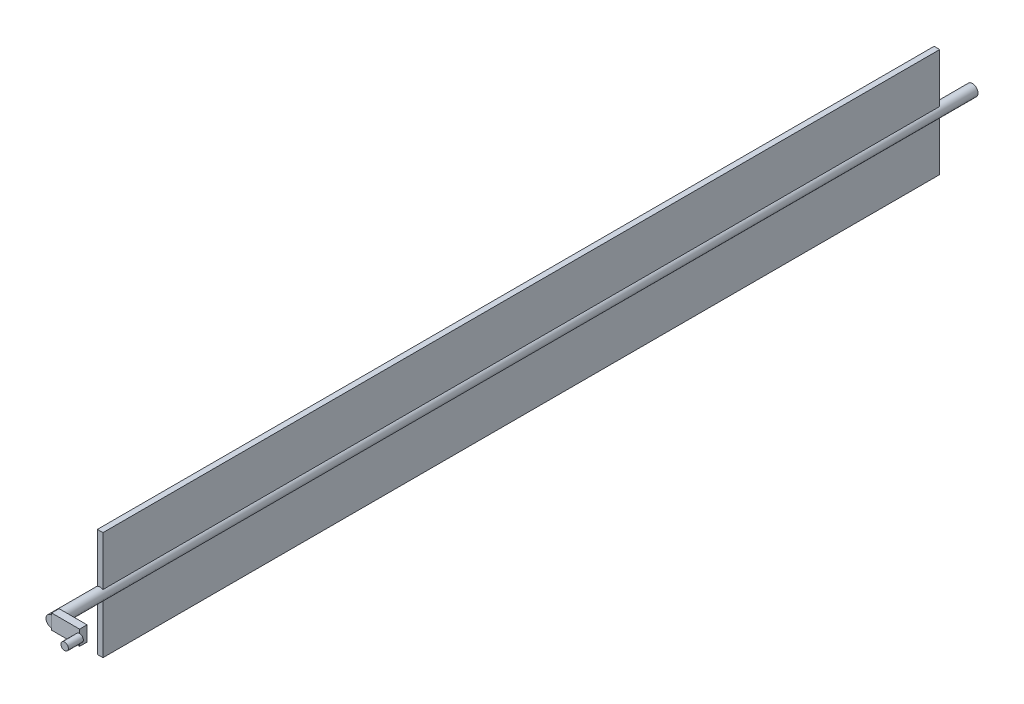
ISO-10303-21;
HEADER;
FILE_DESCRIPTION(('STEP AP214'),'2;1');
FILE_NAME('part.step','',(''),(''),'','','');
FILE_SCHEMA(('AUTOMOTIVE_DESIGN { 1 0 10303 214 1 1 1 1 }'));
ENDSEC;
DATA;
#1=APPLICATION_CONTEXT('core data for automotive mechanical design processes');
#2=APPLICATION_PROTOCOL_DEFINITION('international standard','automotive_design',2000,#1);
#3=PRODUCT_CONTEXT('',#1,'mechanical');
#4=PRODUCT('Part','Part','',(#3));
#5=PRODUCT_RELATED_PRODUCT_CATEGORY('part','',(#4));
#6=PRODUCT_DEFINITION_FORMATION('','',#4);
#7=PRODUCT_DEFINITION_CONTEXT('part definition',#1,'design');
#8=PRODUCT_DEFINITION('design','',#6,#7);
#9=PRODUCT_DEFINITION_SHAPE('','',#8);
#10=(LENGTH_UNIT() NAMED_UNIT(*) SI_UNIT(.MILLI.,.METRE.));
#11=(NAMED_UNIT(*) PLANE_ANGLE_UNIT() SI_UNIT($,.RADIAN.));
#12=(NAMED_UNIT(*) SI_UNIT($,.STERADIAN.) SOLID_ANGLE_UNIT());
#13=UNCERTAINTY_MEASURE_WITH_UNIT(LENGTH_MEASURE(1.E-05),#10,'distance_accuracy_value','');
#14=(GEOMETRIC_REPRESENTATION_CONTEXT(3) GLOBAL_UNCERTAINTY_ASSIGNED_CONTEXT((#13)) GLOBAL_UNIT_ASSIGNED_CONTEXT((#10,
#11,#12)) REPRESENTATION_CONTEXT('',''));
#15=CARTESIAN_POINT('',(0.,0.,0.));
#16=DIRECTION('',(0.,0.,1.));
#17=DIRECTION('',(1.,0.,0.));
#18=AXIS2_PLACEMENT_3D('',#15,#16,#17);
#19=CARTESIAN_POINT('',(15.,0.,503.));
#20=DIRECTION('',(0.,0.,-1.));
#21=DIRECTION('',(-1.,0.,0.));
#22=AXIS2_PLACEMENT_3D('',#19,#20,#21);
#23=CYLINDRICAL_SURFACE('',#22,2.);
#24=CARTESIAN_POINT('',(15.,0.,503.));
#25=DIRECTION('',(0.,0.,1.));
#26=DIRECTION('',(1.,0.,0.));
#27=AXIS2_PLACEMENT_3D('',#24,#25,#26);
#28=CIRCLE('',#27,2.);
#29=CARTESIAN_POINT('',(17.,0.,503.));
#30=VERTEX_POINT('',#29);
#31=EDGE_CURVE('E11',#30,#30,#28,.T.);
#32=ORIENTED_EDGE('',*,*,#31,.F.);
#33=EDGE_LOOP('',(#32));
#34=FACE_BOUND('',#33,.T.);
#35=CARTESIAN_POINT('',(15.,0.,495.));
#36=DIRECTION('',(0.,0.,1.));
#37=DIRECTION('',(1.,0.,0.));
#38=AXIS2_PLACEMENT_3D('',#35,#36,#37);
#39=CIRCLE('',#38,2.);
#40=CARTESIAN_POINT('',(17.,0.,495.));
#41=VERTEX_POINT('',#40);
#42=EDGE_CURVE('E49',#41,#41,#39,.T.);
#43=ORIENTED_EDGE('',*,*,#42,.T.);
#44=EDGE_LOOP('',(#43));
#45=FACE_BOUND('',#44,.T.);
#46=ADVANCED_FACE('F46',(#34,#45),#23,.T.);
#47=CARTESIAN_POINT('',(15.,0.,503.));
#48=DIRECTION('',(0.,0.,1.));
#49=DIRECTION('',(1.,0.,0.));
#50=AXIS2_PLACEMENT_3D('',#47,#48,#49);
#51=PLANE('',#50);
#52=ORIENTED_EDGE('',*,*,#31,.T.);
#53=EDGE_LOOP('',(#52));
#54=FACE_BOUND('',#53,.T.);
#55=ADVANCED_FACE('F61',(#54),#51,.T.);
#56=CARTESIAN_POINT('',(15.,0.,495.));
#57=DIRECTION('',(0.,0.,1.));
#58=DIRECTION('',(1.,0.,0.));
#59=AXIS2_PLACEMENT_3D('',#56,#57,#58);
#60=PLANE('',#59);
#61=ORIENTED_EDGE('',*,*,#42,.F.);
#62=EDGE_LOOP('',(#61));
#63=FACE_BOUND('',#62,.T.);
#64=ADVANCED_FACE('F59',(#63),#60,.F.);
#65=CLOSED_SHELL('',(#46,#55,#64));
#66=MANIFOLD_SOLID_BREP('B2',#65);
#67=CARTESIAN_POINT('',(0.,0.,495.));
#68=DIRECTION('',(0.,0.,-1.));
#69=DIRECTION('',(-1.,0.,0.));
#70=AXIS2_PLACEMENT_3D('',#67,#68,#69);
#71=CYLINDRICAL_SURFACE('',#70,3.);
#72=CARTESIAN_POINT('',(0.,0.,495.));
#73=DIRECTION('',(0.,0.,1.));
#74=DIRECTION('',(1.,0.,0.));
#75=AXIS2_PLACEMENT_3D('',#72,#73,#74);
#76=CIRCLE('',#75,3.);
#77=CARTESIAN_POINT('',(3.,0.,495.));
#78=VERTEX_POINT('',#77);
#79=EDGE_CURVE('E45',#78,#78,#76,.T.);
#80=ORIENTED_EDGE('',*,*,#79,.F.);
#81=EDGE_LOOP('',(#80));
#82=FACE_BOUND('',#81,.T.);
#83=CARTESIAN_POINT('',(0.,0.,2.));
#84=DIRECTION('',(0.,0.,1.));
#85=DIRECTION('',(1.,0.,0.));
#86=AXIS2_PLACEMENT_3D('',#83,#84,#85);
#87=CIRCLE('',#86,3.);
#88=CARTESIAN_POINT('',(3.,0.,2.));
#89=VERTEX_POINT('',#88);
#90=EDGE_CURVE('E100',#89,#89,#87,.T.);
#91=ORIENTED_EDGE('',*,*,#90,.T.);
#92=EDGE_LOOP('',(#91));
#93=FACE_BOUND('',#92,.T.);
#94=ADVANCED_FACE('F97',(#82,#93),#71,.T.);
#95=CARTESIAN_POINT('',(0.,0.,495.));
#96=DIRECTION('',(0.,0.,1.));
#97=DIRECTION('',(1.,0.,0.));
#98=AXIS2_PLACEMENT_3D('',#95,#96,#97);
#99=PLANE('',#98);
#100=ORIENTED_EDGE('',*,*,#79,.T.);
#101=EDGE_LOOP('',(#100));
#102=FACE_BOUND('',#101,.T.);
#103=ADVANCED_FACE('F112',(#102),#99,.T.);
#104=CARTESIAN_POINT('',(0.,0.,2.));
#105=DIRECTION('',(0.,0.,1.));
#106=DIRECTION('',(1.,0.,0.));
#107=AXIS2_PLACEMENT_3D('',#104,#105,#106);
#108=PLANE('',#107);
#109=ORIENTED_EDGE('',*,*,#90,.F.);
#110=EDGE_LOOP('',(#109));
#111=FACE_BOUND('',#110,.T.);
#112=ADVANCED_FACE('F110',(#111),#108,.F.);
#113=CLOSED_SHELL('',(#94,#103,#112));
#114=MANIFOLD_SOLID_BREP('B6',#113);
#115=CARTESIAN_POINT('',(1.5,-29.,469.));
#116=DIRECTION('',(0.,0.,-1.));
#117=DIRECTION('',(-1.,0.,0.));
#118=AXIS2_PLACEMENT_3D('',#115,#116,#117);
#119=PLANE('',#118);
#120=DIRECTION('',(0.,-1.,0.));
#121=VECTOR('',#120,1.);
#122=CARTESIAN_POINT('',(-1.5,-29.,469.));
#123=LINE('',#122,#121);
#124=CARTESIAN_POINT('',(-1.5,29.,469.));
#125=VERTEX_POINT('',#124);
#126=CARTESIAN_POINT('',(-1.5,-29.,469.));
#127=VERTEX_POINT('',#126);
#128=EDGE_CURVE('E210',#125,#127,#123,.T.);
#129=ORIENTED_EDGE('',*,*,#128,.T.);
#130=DIRECTION('',(-1.,0.,0.));
#131=VECTOR('',#130,1.);
#132=CARTESIAN_POINT('',(1.5,-29.,469.));
#133=LINE('',#132,#131);
#134=CARTESIAN_POINT('',(1.5,-29.,469.));
#135=VERTEX_POINT('',#134);
#136=EDGE_CURVE('E95',#135,#127,#133,.T.);
#137=ORIENTED_EDGE('',*,*,#136,.F.);
#138=DIRECTION('',(0.,-1.,0.));
#139=VECTOR('',#138,1.);
#140=CARTESIAN_POINT('',(1.5,-29.,469.));
#141=LINE('',#140,#139);
#142=CARTESIAN_POINT('',(1.5,29.,469.));
#143=VERTEX_POINT('',#142);
#144=EDGE_CURVE('E198',#143,#135,#141,.T.);
#145=ORIENTED_EDGE('',*,*,#144,.F.);
#146=DIRECTION('',(-1.,0.,0.));
#147=VECTOR('',#146,1.);
#148=CARTESIAN_POINT('',(1.5,29.,469.));
#149=LINE('',#148,#147);
#150=EDGE_CURVE('E206',#143,#125,#149,.T.);
#151=ORIENTED_EDGE('',*,*,#150,.T.);
#152=EDGE_LOOP('',(#129,#137,#145,#151));
#153=FACE_BOUND('',#152,.T.);
#154=ADVANCED_FACE('F147',(#153),#119,.F.);
#155=CARTESIAN_POINT('',(1.5,-29.,21.));
#156=DIRECTION('',(0.,1.,0.));
#157=DIRECTION('',(0.,0.,1.));
#158=AXIS2_PLACEMENT_3D('',#155,#156,#157);
#159=PLANE('',#158);
#160=DIRECTION('',(0.,0.,-1.));
#161=VECTOR('',#160,1.);
#162=CARTESIAN_POINT('',(-1.5,-29.,21.));
#163=LINE('',#162,#161);
#164=CARTESIAN_POINT('',(-1.5,-29.,21.));
#165=VERTEX_POINT('',#164);
#166=EDGE_CURVE('E202',#127,#165,#163,.T.);
#167=ORIENTED_EDGE('',*,*,#166,.T.);
#168=DIRECTION('',(-1.,0.,0.));
#169=VECTOR('',#168,1.);
#170=CARTESIAN_POINT('',(1.5,-29.,21.));
#171=LINE('',#170,#169);
#172=CARTESIAN_POINT('',(1.5,-29.,21.));
#173=VERTEX_POINT('',#172);
#174=EDGE_CURVE('E155',#173,#165,#171,.T.);
#175=ORIENTED_EDGE('',*,*,#174,.F.);
#176=DIRECTION('',(0.,0.,-1.));
#177=VECTOR('',#176,1.);
#178=CARTESIAN_POINT('',(1.5,-29.,21.));
#179=LINE('',#178,#177);
#180=EDGE_CURVE('E193',#135,#173,#179,.T.);
#181=ORIENTED_EDGE('',*,*,#180,.F.);
#182=ORIENTED_EDGE('',*,*,#136,.T.);
#183=EDGE_LOOP('',(#167,#175,#181,#182));
#184=FACE_BOUND('',#183,.T.);
#185=ADVANCED_FACE('F201',(#184),#159,.F.);
#186=CARTESIAN_POINT('',(1.5,-29.,21.));
#187=DIRECTION('',(0.,0.,1.));
#188=DIRECTION('',(1.,0.,0.));
#189=AXIS2_PLACEMENT_3D('',#186,#187,#188);
#190=PLANE('',#189);
#191=DIRECTION('',(0.,1.,0.));
#192=VECTOR('',#191,1.);
#193=CARTESIAN_POINT('',(-1.5,-29.,21.));
#194=LINE('',#193,#192);
#195=CARTESIAN_POINT('',(-1.5,29.,21.));
#196=VERTEX_POINT('',#195);
#197=EDGE_CURVE('E180',#165,#196,#194,.T.);
#198=ORIENTED_EDGE('',*,*,#197,.T.);
#199=DIRECTION('',(-1.,0.,0.));
#200=VECTOR('',#199,1.);
#201=CARTESIAN_POINT('',(1.5,29.,21.));
#202=LINE('',#201,#200);
#203=CARTESIAN_POINT('',(1.5,29.,21.));
#204=VERTEX_POINT('',#203);
#205=EDGE_CURVE('E203',#204,#196,#202,.T.);
#206=ORIENTED_EDGE('',*,*,#205,.F.);
#207=DIRECTION('',(0.,1.,0.));
#208=VECTOR('',#207,1.);
#209=CARTESIAN_POINT('',(1.5,-29.,21.));
#210=LINE('',#209,#208);
#211=EDGE_CURVE('E196',#173,#204,#210,.T.);
#212=ORIENTED_EDGE('',*,*,#211,.F.);
#213=ORIENTED_EDGE('',*,*,#174,.T.);
#214=EDGE_LOOP('',(#198,#206,#212,#213));
#215=FACE_BOUND('',#214,.T.);
#216=ADVANCED_FACE('F204',(#215),#190,.F.);
#217=CARTESIAN_POINT('',(1.5,29.,21.));
#218=DIRECTION('',(0.,-1.,0.));
#219=DIRECTION('',(0.,0.,-1.));
#220=AXIS2_PLACEMENT_3D('',#217,#218,#219);
#221=PLANE('',#220);
#222=DIRECTION('',(0.,0.,1.));
#223=VECTOR('',#222,1.);
#224=CARTESIAN_POINT('',(-1.5,29.,21.));
#225=LINE('',#224,#223);
#226=EDGE_CURVE('E186',#196,#125,#225,.T.);
#227=ORIENTED_EDGE('',*,*,#226,.T.);
#228=ORIENTED_EDGE('',*,*,#150,.F.);
#229=DIRECTION('',(0.,0.,1.));
#230=VECTOR('',#229,1.);
#231=CARTESIAN_POINT('',(1.5,29.,21.));
#232=LINE('',#231,#230);
#233=EDGE_CURVE('E163',#204,#143,#232,.T.);
#234=ORIENTED_EDGE('',*,*,#233,.F.);
#235=ORIENTED_EDGE('',*,*,#205,.T.);
#236=EDGE_LOOP('',(#227,#228,#234,#235));
#237=FACE_BOUND('',#236,.T.);
#238=ADVANCED_FACE('F217',(#237),#221,.F.);
#239=CARTESIAN_POINT('',(1.5,0.,0.));
#240=DIRECTION('',(1.,0.,0.));
#241=DIRECTION('',(0.,0.,-1.));
#242=AXIS2_PLACEMENT_3D('',#239,#240,#241);
#243=PLANE('',#242);
#244=ORIENTED_EDGE('',*,*,#144,.T.);
#245=ORIENTED_EDGE('',*,*,#180,.T.);
#246=ORIENTED_EDGE('',*,*,#211,.T.);
#247=ORIENTED_EDGE('',*,*,#233,.T.);
#248=EDGE_LOOP('',(#244,#245,#246,#247));
#249=FACE_BOUND('',#248,.T.);
#250=ADVANCED_FACE('F194',(#249),#243,.T.);
#251=CARTESIAN_POINT('',(-1.5,0.,0.));
#252=DIRECTION('',(1.,0.,0.));
#253=DIRECTION('',(0.,0.,-1.));
#254=AXIS2_PLACEMENT_3D('',#251,#252,#253);
#255=PLANE('',#254);
#256=ORIENTED_EDGE('',*,*,#128,.F.);
#257=ORIENTED_EDGE('',*,*,#226,.F.);
#258=ORIENTED_EDGE('',*,*,#197,.F.);
#259=ORIENTED_EDGE('',*,*,#166,.F.);
#260=EDGE_LOOP('',(#256,#257,#258,#259));
#261=FACE_BOUND('',#260,.T.);
#262=ADVANCED_FACE('F220',(#261),#255,.F.);
#263=CLOSED_SHELL('',(#154,#185,#216,#238,#250,#262));
#264=MANIFOLD_SOLID_BREP('B40',#263);
#265=CARTESIAN_POINT('',(15.,-4.,495.));
#266=DIRECTION('',(0.,0.,-1.));
#267=DIRECTION('',(-1.,0.,0.));
#268=AXIS2_PLACEMENT_3D('',#265,#266,#267);
#269=PLANE('',#268);
#270=DIRECTION('',(0.,-1.,0.));
#271=VECTOR('',#270,1.);
#272=CARTESIAN_POINT('',(0.,-4.,495.));
#273=LINE('',#272,#271);
#274=CARTESIAN_POINT('',(0.,4.,495.));
#275=VERTEX_POINT('',#274);
#276=CARTESIAN_POINT('',(0.,-4.,495.));
#277=VERTEX_POINT('',#276);
#278=EDGE_CURVE('E334',#275,#277,#273,.T.);
#279=ORIENTED_EDGE('',*,*,#278,.T.);
#280=DIRECTION('',(-1.,0.,0.));
#281=VECTOR('',#280,1.);
#282=CARTESIAN_POINT('',(15.,-4.,495.));
#283=LINE('',#282,#281);
#284=CARTESIAN_POINT('',(15.,-4.,495.));
#285=VERTEX_POINT('',#284);
#286=EDGE_CURVE('E145',#285,#277,#283,.T.);
#287=ORIENTED_EDGE('',*,*,#286,.F.);
#288=DIRECTION('',(0.,-1.,0.));
#289=VECTOR('',#288,1.);
#290=CARTESIAN_POINT('',(15.,-4.,495.));
#291=LINE('',#290,#289);
#292=CARTESIAN_POINT('',(15.,4.,495.));
#293=VERTEX_POINT('',#292);
#294=EDGE_CURVE('E322',#293,#285,#291,.T.);
#295=ORIENTED_EDGE('',*,*,#294,.F.);
#296=DIRECTION('',(-1.,0.,0.));
#297=VECTOR('',#296,1.);
#298=CARTESIAN_POINT('',(15.,4.,495.));
#299=LINE('',#298,#297);
#300=EDGE_CURVE('E330',#293,#275,#299,.T.);
#301=ORIENTED_EDGE('',*,*,#300,.T.);
#302=EDGE_LOOP('',(#279,#287,#295,#301));
#303=FACE_BOUND('',#302,.T.);
#304=ADVANCED_FACE('F271',(#303),#269,.F.);
#305=CARTESIAN_POINT('',(15.,-4.,491.));
#306=DIRECTION('',(0.,1.,0.));
#307=DIRECTION('',(0.,0.,1.));
#308=AXIS2_PLACEMENT_3D('',#305,#306,#307);
#309=PLANE('',#308);
#310=DIRECTION('',(0.,0.,-1.));
#311=VECTOR('',#310,1.);
#312=CARTESIAN_POINT('',(0.,-4.,491.));
#313=LINE('',#312,#311);
#314=CARTESIAN_POINT('',(0.,-4.,491.));
#315=VERTEX_POINT('',#314);
#316=EDGE_CURVE('E326',#277,#315,#313,.T.);
#317=ORIENTED_EDGE('',*,*,#316,.T.);
#318=DIRECTION('',(-1.,0.,0.));
#319=VECTOR('',#318,1.);
#320=CARTESIAN_POINT('',(15.,-4.,491.));
#321=LINE('',#320,#319);
#322=CARTESIAN_POINT('',(15.,-4.,491.));
#323=VERTEX_POINT('',#322);
#324=EDGE_CURVE('E279',#323,#315,#321,.T.);
#325=ORIENTED_EDGE('',*,*,#324,.F.);
#326=DIRECTION('',(0.,0.,-1.));
#327=VECTOR('',#326,1.);
#328=CARTESIAN_POINT('',(15.,-4.,491.));
#329=LINE('',#328,#327);
#330=EDGE_CURVE('E317',#285,#323,#329,.T.);
#331=ORIENTED_EDGE('',*,*,#330,.F.);
#332=ORIENTED_EDGE('',*,*,#286,.T.);
#333=EDGE_LOOP('',(#317,#325,#331,#332));
#334=FACE_BOUND('',#333,.T.);
#335=ADVANCED_FACE('F325',(#334),#309,.F.);
#336=CARTESIAN_POINT('',(15.,-4.,491.));
#337=DIRECTION('',(0.,0.,1.));
#338=DIRECTION('',(1.,0.,0.));
#339=AXIS2_PLACEMENT_3D('',#336,#337,#338);
#340=PLANE('',#339);
#341=DIRECTION('',(0.,1.,0.));
#342=VECTOR('',#341,1.);
#343=CARTESIAN_POINT('',(0.,-4.,491.));
#344=LINE('',#343,#342);
#345=CARTESIAN_POINT('',(0.,4.,491.));
#346=VERTEX_POINT('',#345);
#347=EDGE_CURVE('E304',#315,#346,#344,.T.);
#348=ORIENTED_EDGE('',*,*,#347,.T.);
#349=DIRECTION('',(-1.,0.,0.));
#350=VECTOR('',#349,1.);
#351=CARTESIAN_POINT('',(15.,4.,491.));
#352=LINE('',#351,#350);
#353=CARTESIAN_POINT('',(15.,4.,491.));
#354=VERTEX_POINT('',#353);
#355=EDGE_CURVE('E327',#354,#346,#352,.T.);
#356=ORIENTED_EDGE('',*,*,#355,.F.);
#357=DIRECTION('',(0.,1.,0.));
#358=VECTOR('',#357,1.);
#359=CARTESIAN_POINT('',(15.,-4.,491.));
#360=LINE('',#359,#358);
#361=EDGE_CURVE('E320',#323,#354,#360,.T.);
#362=ORIENTED_EDGE('',*,*,#361,.F.);
#363=ORIENTED_EDGE('',*,*,#324,.T.);
#364=EDGE_LOOP('',(#348,#356,#362,#363));
#365=FACE_BOUND('',#364,.T.);
#366=ADVANCED_FACE('F328',(#365),#340,.F.);
#367=CARTESIAN_POINT('',(15.,4.,491.));
#368=DIRECTION('',(0.,-1.,0.));
#369=DIRECTION('',(0.,0.,-1.));
#370=AXIS2_PLACEMENT_3D('',#367,#368,#369);
#371=PLANE('',#370);
#372=DIRECTION('',(0.,0.,1.));
#373=VECTOR('',#372,1.);
#374=CARTESIAN_POINT('',(0.,4.,491.));
#375=LINE('',#374,#373);
#376=EDGE_CURVE('E310',#346,#275,#375,.T.);
#377=ORIENTED_EDGE('',*,*,#376,.T.);
#378=ORIENTED_EDGE('',*,*,#300,.F.);
#379=DIRECTION('',(0.,0.,1.));
#380=VECTOR('',#379,1.);
#381=CARTESIAN_POINT('',(15.,4.,491.));
#382=LINE('',#381,#380);
#383=EDGE_CURVE('E287',#354,#293,#382,.T.);
#384=ORIENTED_EDGE('',*,*,#383,.F.);
#385=ORIENTED_EDGE('',*,*,#355,.T.);
#386=EDGE_LOOP('',(#377,#378,#384,#385));
#387=FACE_BOUND('',#386,.T.);
#388=ADVANCED_FACE('F341',(#387),#371,.F.);
#389=CARTESIAN_POINT('',(15.,0.,0.));
#390=DIRECTION('',(1.,0.,0.));
#391=DIRECTION('',(0.,0.,-1.));
#392=AXIS2_PLACEMENT_3D('',#389,#390,#391);
#393=PLANE('',#392);
#394=ORIENTED_EDGE('',*,*,#294,.T.);
#395=ORIENTED_EDGE('',*,*,#330,.T.);
#396=ORIENTED_EDGE('',*,*,#361,.T.);
#397=ORIENTED_EDGE('',*,*,#383,.T.);
#398=EDGE_LOOP('',(#394,#395,#396,#397));
#399=FACE_BOUND('',#398,.T.);
#400=ADVANCED_FACE('F318',(#399),#393,.T.);
#401=CARTESIAN_POINT('',(0.,0.,0.));
#402=DIRECTION('',(1.,0.,0.));
#403=DIRECTION('',(0.,0.,-1.));
#404=AXIS2_PLACEMENT_3D('',#401,#402,#403);
#405=PLANE('',#404);
#406=ORIENTED_EDGE('',*,*,#278,.F.);
#407=ORIENTED_EDGE('',*,*,#376,.F.);
#408=ORIENTED_EDGE('',*,*,#347,.F.);
#409=ORIENTED_EDGE('',*,*,#316,.F.);
#410=EDGE_LOOP('',(#406,#407,#408,#409));
#411=FACE_BOUND('',#410,.T.);
#412=ADVANCED_FACE('F344',(#411),#405,.F.);
#413=CLOSED_SHELL('',(#304,#335,#366,#388,#400,#412));
#414=MANIFOLD_SOLID_BREP('B89',#413);
#415=ADVANCED_BREP_SHAPE_REPRESENTATION('',(#18,#66,#114,#264,#414),#14);
#416=SHAPE_DEFINITION_REPRESENTATION(#9,#415);
ENDSEC;
END-ISO-10303-21;
